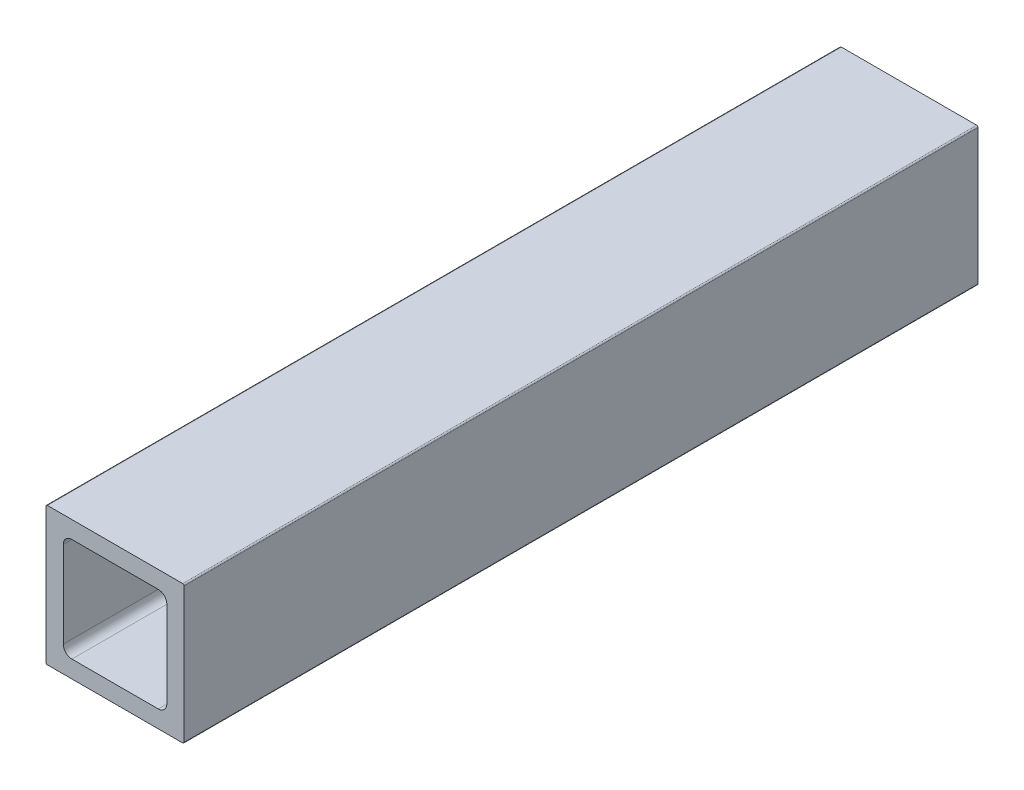
ISO-10303-21;
HEADER;
FILE_DESCRIPTION(('STEP AP214'),'2;1');
FILE_NAME('part.step','',(''),(''),'','','');
FILE_SCHEMA(('AUTOMOTIVE_DESIGN { 1 0 10303 214 1 1 1 1 }'));
ENDSEC;
DATA;
#1=APPLICATION_CONTEXT('core data for automotive mechanical design processes');
#2=APPLICATION_PROTOCOL_DEFINITION('international standard','automotive_design',2000,#1);
#3=PRODUCT_CONTEXT('',#1,'mechanical');
#4=PRODUCT('Part','Part','',(#3));
#5=PRODUCT_RELATED_PRODUCT_CATEGORY('part','',(#4));
#6=PRODUCT_DEFINITION_FORMATION('','',#4);
#7=PRODUCT_DEFINITION_CONTEXT('part definition',#1,'design');
#8=PRODUCT_DEFINITION('design','',#6,#7);
#9=PRODUCT_DEFINITION_SHAPE('','',#8);
#10=(LENGTH_UNIT() NAMED_UNIT(*) SI_UNIT(.MILLI.,.METRE.));
#11=(NAMED_UNIT(*) PLANE_ANGLE_UNIT() SI_UNIT($,.RADIAN.));
#12=(NAMED_UNIT(*) SI_UNIT($,.STERADIAN.) SOLID_ANGLE_UNIT());
#13=UNCERTAINTY_MEASURE_WITH_UNIT(LENGTH_MEASURE(1.E-05),#10,'distance_accuracy_value','');
#14=(GEOMETRIC_REPRESENTATION_CONTEXT(3) GLOBAL_UNCERTAINTY_ASSIGNED_CONTEXT((#13)) GLOBAL_UNIT_ASSIGNED_CONTEXT((#10,
#11,#12)) REPRESENTATION_CONTEXT('',''));
#15=CARTESIAN_POINT('',(0.,0.,0.));
#16=DIRECTION('',(0.,0.,1.));
#17=DIRECTION('',(1.,0.,0.));
#18=AXIS2_PLACEMENT_3D('',#15,#16,#17);
#19=CARTESIAN_POINT('',(0.254,0.254,0.));
#20=DIRECTION('',(0.,0.,-1.));
#21=DIRECTION('',(0.,-1.,0.));
#22=AXIS2_PLACEMENT_3D('',#19,#20,#21);
#23=PLANE('',#22);
#24=CARTESIAN_POINT('',(0.254,0.254,0.));
#25=DIRECTION('',(0.,0.,1.));
#26=DIRECTION('',(-1.,0.,0.));
#27=AXIS2_PLACEMENT_3D('',#24,#25,#26);
#28=CIRCLE('',#27,0.254);
#29=CARTESIAN_POINT('',(0.,0.254,0.));
#30=VERTEX_POINT('',#29);
#31=CARTESIAN_POINT('',(0.254,0.,0.));
#32=VERTEX_POINT('',#31);
#33=EDGE_CURVE('E193',#30,#32,#28,.T.);
#34=ORIENTED_EDGE('',*,*,#33,.F.);
#35=DIRECTION('',(0.,-1.,0.));
#36=VECTOR('',#35,1.);
#37=CARTESIAN_POINT('',(0.,0.254,0.));
#38=LINE('',#37,#36);
#39=CARTESIAN_POINT('',(0.,25.146,0.));
#40=VERTEX_POINT('',#39);
#41=EDGE_CURVE('E191',#40,#30,#38,.T.);
#42=ORIENTED_EDGE('',*,*,#41,.F.);
#43=CARTESIAN_POINT('',(0.254,25.146,0.));
#44=DIRECTION('',(0.,0.,1.));
#45=DIRECTION('',(-1.,0.,0.));
#46=AXIS2_PLACEMENT_3D('',#43,#44,#45);
#47=CIRCLE('',#46,0.254);
#48=CARTESIAN_POINT('',(0.254,25.4,0.));
#49=VERTEX_POINT('',#48);
#50=EDGE_CURVE('E213',#49,#40,#47,.T.);
#51=ORIENTED_EDGE('',*,*,#50,.F.);
#52=DIRECTION('',(-1.,0.,0.));
#53=VECTOR('',#52,1.);
#54=CARTESIAN_POINT('',(0.254,25.4,0.));
#55=LINE('',#54,#53);
#56=CARTESIAN_POINT('',(25.146,25.4,0.));
#57=VERTEX_POINT('',#56);
#58=EDGE_CURVE('E204',#57,#49,#55,.T.);
#59=ORIENTED_EDGE('',*,*,#58,.F.);
#60=CARTESIAN_POINT('',(25.146,25.146,0.));
#61=DIRECTION('',(0.,0.,1.));
#62=DIRECTION('',(-1.,0.,0.));
#63=AXIS2_PLACEMENT_3D('',#60,#61,#62);
#64=CIRCLE('',#63,0.254);
#65=CARTESIAN_POINT('',(25.4,25.146,0.));
#66=VERTEX_POINT('',#65);
#67=EDGE_CURVE('E236',#66,#57,#64,.T.);
#68=ORIENTED_EDGE('',*,*,#67,.F.);
#69=DIRECTION('',(0.,1.,0.));
#70=VECTOR('',#69,1.);
#71=CARTESIAN_POINT('',(25.4,0.254,0.));
#72=LINE('',#71,#70);
#73=CARTESIAN_POINT('',(25.4,0.254,0.));
#74=VERTEX_POINT('',#73);
#75=EDGE_CURVE('E235',#74,#66,#72,.T.);
#76=ORIENTED_EDGE('',*,*,#75,.F.);
#77=CARTESIAN_POINT('',(25.146,0.254,0.));
#78=DIRECTION('',(0.,0.,1.));
#79=DIRECTION('',(1.,0.,0.));
#80=AXIS2_PLACEMENT_3D('',#77,#78,#79);
#81=CIRCLE('',#80,0.254);
#82=CARTESIAN_POINT('',(25.146,0.,0.));
#83=VERTEX_POINT('',#82);
#84=EDGE_CURVE('E206',#83,#74,#81,.T.);
#85=ORIENTED_EDGE('',*,*,#84,.F.);
#86=DIRECTION('',(1.,0.,0.));
#87=VECTOR('',#86,1.);
#88=CARTESIAN_POINT('',(0.254,0.,0.));
#89=LINE('',#88,#87);
#90=EDGE_CURVE('E194',#32,#83,#89,.T.);
#91=ORIENTED_EDGE('',*,*,#90,.F.);
#92=EDGE_LOOP('',(#34,#42,#51,#59,#68,#76,#85,#91));
#93=FACE_BOUND('',#92,.T.);
#94=DIRECTION('',(0.,-1.,0.));
#95=VECTOR('',#94,1.);
#96=CARTESIAN_POINT('',(3.175,4.7625,0.));
#97=LINE('',#96,#95);
#98=CARTESIAN_POINT('',(3.175,20.6375,0.));
#99=VERTEX_POINT('',#98);
#100=CARTESIAN_POINT('',(3.175,4.7625,0.));
#101=VERTEX_POINT('',#100);
#102=EDGE_CURVE('E52',#99,#101,#97,.T.);
#103=ORIENTED_EDGE('',*,*,#102,.T.);
#104=CARTESIAN_POINT('',(4.7625,4.7625,0.));
#105=DIRECTION('',(0.,0.,1.));
#106=DIRECTION('',(1.,0.,0.));
#107=AXIS2_PLACEMENT_3D('',#104,#105,#106);
#108=CIRCLE('',#107,1.5875);
#109=CARTESIAN_POINT('',(4.7625,3.175,0.));
#110=VERTEX_POINT('',#109);
#111=EDGE_CURVE('E266',#101,#110,#108,.T.);
#112=ORIENTED_EDGE('',*,*,#111,.T.);
#113=DIRECTION('',(1.,0.,0.));
#114=VECTOR('',#113,1.);
#115=CARTESIAN_POINT('',(4.7625,3.175,0.));
#116=LINE('',#115,#114);
#117=CARTESIAN_POINT('',(20.6375,3.175,0.));
#118=VERTEX_POINT('',#117);
#119=EDGE_CURVE('E250',#110,#118,#116,.T.);
#120=ORIENTED_EDGE('',*,*,#119,.T.);
#121=CARTESIAN_POINT('',(20.6375,4.7625,0.));
#122=DIRECTION('',(0.,0.,1.));
#123=DIRECTION('',(-1.,0.,0.));
#124=AXIS2_PLACEMENT_3D('',#121,#122,#123);
#125=CIRCLE('',#124,1.5875);
#126=CARTESIAN_POINT('',(22.225,4.7625,0.));
#127=VERTEX_POINT('',#126);
#128=EDGE_CURVE('E223',#118,#127,#125,.T.);
#129=ORIENTED_EDGE('',*,*,#128,.T.);
#130=DIRECTION('',(0.,1.,0.));
#131=VECTOR('',#130,1.);
#132=CARTESIAN_POINT('',(22.225,4.7625,0.));
#133=LINE('',#132,#131);
#134=CARTESIAN_POINT('',(22.225,20.6375,0.));
#135=VERTEX_POINT('',#134);
#136=EDGE_CURVE('E219',#127,#135,#133,.T.);
#137=ORIENTED_EDGE('',*,*,#136,.T.);
#138=CARTESIAN_POINT('',(20.6375,20.6375,0.));
#139=DIRECTION('',(0.,0.,1.));
#140=DIRECTION('',(-1.,0.,0.));
#141=AXIS2_PLACEMENT_3D('',#138,#139,#140);
#142=CIRCLE('',#141,1.5875);
#143=CARTESIAN_POINT('',(20.6375,22.225,0.));
#144=VERTEX_POINT('',#143);
#145=EDGE_CURVE('E224',#135,#144,#142,.T.);
#146=ORIENTED_EDGE('',*,*,#145,.T.);
#147=DIRECTION('',(-1.,0.,0.));
#148=VECTOR('',#147,1.);
#149=CARTESIAN_POINT('',(4.7625,22.225,0.));
#150=LINE('',#149,#148);
#151=CARTESIAN_POINT('',(4.7625,22.225,0.));
#152=VERTEX_POINT('',#151);
#153=EDGE_CURVE('E229',#144,#152,#150,.T.);
#154=ORIENTED_EDGE('',*,*,#153,.T.);
#155=CARTESIAN_POINT('',(4.7625,20.6375,0.));
#156=DIRECTION('',(0.,0.,1.));
#157=DIRECTION('',(-1.,0.,0.));
#158=AXIS2_PLACEMENT_3D('',#155,#156,#157);
#159=CIRCLE('',#158,1.5875);
#160=EDGE_CURVE('E197',#152,#99,#159,.T.);
#161=ORIENTED_EDGE('',*,*,#160,.T.);
#162=EDGE_LOOP('',(#103,#112,#120,#129,#137,#146,#154,#161));
#163=FACE_BOUND('',#162,.T.);
#164=ADVANCED_FACE('F44',(#93,#163),#23,.T.);
#165=CARTESIAN_POINT('',(0.254,0.254,1828.8));
#166=DIRECTION('',(0.,0.,-1.));
#167=DIRECTION('',(-1.,0.,0.));
#168=AXIS2_PLACEMENT_3D('',#165,#166,#167);
#169=CYLINDRICAL_SURFACE('',#168,0.254);
#170=CARTESIAN_POINT('',(0.254,0.254,146.05));
#171=DIRECTION('',(0.,0.,-1.));
#172=DIRECTION('',(-1.,0.,0.));
#173=AXIS2_PLACEMENT_3D('',#170,#171,#172);
#174=CIRCLE('',#173,0.254);
#175=CARTESIAN_POINT('',(0.,0.254,146.05));
#176=VERTEX_POINT('',#175);
#177=CARTESIAN_POINT('',(0.254,0.,146.05));
#178=VERTEX_POINT('',#177);
#179=EDGE_CURVE('E172',#176,#178,#174,.F.);
#180=ORIENTED_EDGE('',*,*,#179,.F.);
#181=DIRECTION('',(0.,0.,-1.));
#182=VECTOR('',#181,1.);
#183=CARTESIAN_POINT('',(0.,0.254,1828.8));
#184=LINE('',#183,#182);
#185=EDGE_CURVE('E183',#176,#30,#184,.T.);
#186=ORIENTED_EDGE('',*,*,#185,.T.);
#187=ORIENTED_EDGE('',*,*,#33,.T.);
#188=DIRECTION('',(0.,0.,-1.));
#189=VECTOR('',#188,1.);
#190=CARTESIAN_POINT('',(0.254,0.,1828.8));
#191=LINE('',#190,#189);
#192=EDGE_CURVE('E185',#178,#32,#191,.T.);
#193=ORIENTED_EDGE('',*,*,#192,.F.);
#194=EDGE_LOOP('',(#180,#186,#187,#193));
#195=FACE_BOUND('',#194,.T.);
#196=ADVANCED_FACE('F181',(#195),#169,.T.);
#197=CARTESIAN_POINT('',(0.254,0.,1828.8));
#198=DIRECTION('',(0.,1.,0.));
#199=DIRECTION('',(1.,0.,0.));
#200=AXIS2_PLACEMENT_3D('',#197,#198,#199);
#201=PLANE('',#200);
#202=DIRECTION('',(0.,0.,-1.));
#203=VECTOR('',#202,1.);
#204=CARTESIAN_POINT('',(25.146,0.,1828.8));
#205=LINE('',#204,#203);
#206=CARTESIAN_POINT('',(25.146,0.,146.05));
#207=VERTEX_POINT('',#206);
#208=EDGE_CURVE('E210',#207,#83,#205,.T.);
#209=ORIENTED_EDGE('',*,*,#208,.F.);
#210=DIRECTION('',(1.,0.,0.));
#211=VECTOR('',#210,1.);
#212=CARTESIAN_POINT('',(0.,0.,146.05));
#213=LINE('',#212,#211);
#214=EDGE_CURVE('E177',#178,#207,#213,.T.);
#215=ORIENTED_EDGE('',*,*,#214,.F.);
#216=ORIENTED_EDGE('',*,*,#192,.T.);
#217=ORIENTED_EDGE('',*,*,#90,.T.);
#218=EDGE_LOOP('',(#209,#215,#216,#217));
#219=FACE_BOUND('',#218,.T.);
#220=ADVANCED_FACE('F289',(#219),#201,.F.);
#221=CARTESIAN_POINT('',(25.146,0.254,1828.8));
#222=DIRECTION('',(0.,0.,-1.));
#223=DIRECTION('',(-1.,0.,0.));
#224=AXIS2_PLACEMENT_3D('',#221,#222,#223);
#225=CYLINDRICAL_SURFACE('',#224,0.254);
#226=CARTESIAN_POINT('',(25.146,0.254,146.05));
#227=DIRECTION('',(0.,0.,-1.));
#228=DIRECTION('',(-1.,0.,0.));
#229=AXIS2_PLACEMENT_3D('',#226,#227,#228);
#230=CIRCLE('',#229,0.254);
#231=CARTESIAN_POINT('',(25.4,0.254,146.05));
#232=VERTEX_POINT('',#231);
#233=EDGE_CURVE('E187',#207,#232,#230,.F.);
#234=ORIENTED_EDGE('',*,*,#233,.F.);
#235=ORIENTED_EDGE('',*,*,#208,.T.);
#236=ORIENTED_EDGE('',*,*,#84,.T.);
#237=DIRECTION('',(0.,0.,-1.));
#238=VECTOR('',#237,1.);
#239=CARTESIAN_POINT('',(25.4,0.254,1828.8));
#240=LINE('',#239,#238);
#241=EDGE_CURVE('E233',#232,#74,#240,.T.);
#242=ORIENTED_EDGE('',*,*,#241,.F.);
#243=EDGE_LOOP('',(#234,#235,#236,#242));
#244=FACE_BOUND('',#243,.T.);
#245=ADVANCED_FACE('F283',(#244),#225,.T.);
#246=CARTESIAN_POINT('',(25.4,0.254,1828.8));
#247=DIRECTION('',(-1.,0.,0.));
#248=DIRECTION('',(0.,0.,1.));
#249=AXIS2_PLACEMENT_3D('',#246,#247,#248);
#250=PLANE('',#249);
#251=DIRECTION('',(0.,0.,-1.));
#252=VECTOR('',#251,1.);
#253=CARTESIAN_POINT('',(25.4,25.146,1828.8));
#254=LINE('',#253,#252);
#255=CARTESIAN_POINT('',(25.4,25.146,146.05));
#256=VERTEX_POINT('',#255);
#257=EDGE_CURVE('E258',#256,#66,#254,.T.);
#258=ORIENTED_EDGE('',*,*,#257,.F.);
#259=DIRECTION('',(0.,1.,0.));
#260=VECTOR('',#259,1.);
#261=CARTESIAN_POINT('',(25.4,0.,146.05));
#262=LINE('',#261,#260);
#263=EDGE_CURVE('E498',#232,#256,#262,.T.);
#264=ORIENTED_EDGE('',*,*,#263,.F.);
#265=ORIENTED_EDGE('',*,*,#241,.T.);
#266=ORIENTED_EDGE('',*,*,#75,.T.);
#267=EDGE_LOOP('',(#258,#264,#265,#266));
#268=FACE_BOUND('',#267,.T.);
#269=ADVANCED_FACE('F288',(#268),#250,.F.);
#270=CARTESIAN_POINT('',(25.146,25.146,1828.8));
#271=DIRECTION('',(0.,0.,-1.));
#272=DIRECTION('',(-1.,0.,0.));
#273=AXIS2_PLACEMENT_3D('',#270,#271,#272);
#274=CYLINDRICAL_SURFACE('',#273,0.254);
#275=CARTESIAN_POINT('',(25.146,25.146,146.05));
#276=DIRECTION('',(0.,0.,-1.));
#277=DIRECTION('',(-1.,0.,0.));
#278=AXIS2_PLACEMENT_3D('',#275,#276,#277);
#279=CIRCLE('',#278,0.254);
#280=CARTESIAN_POINT('',(25.146,25.4,146.05));
#281=VERTEX_POINT('',#280);
#282=EDGE_CURVE('E492',#256,#281,#279,.F.);
#283=ORIENTED_EDGE('',*,*,#282,.F.);
#284=ORIENTED_EDGE('',*,*,#257,.T.);
#285=ORIENTED_EDGE('',*,*,#67,.T.);
#286=DIRECTION('',(0.,0.,-1.));
#287=VECTOR('',#286,1.);
#288=CARTESIAN_POINT('',(25.146,25.4,1828.8));
#289=LINE('',#288,#287);
#290=EDGE_CURVE('E227',#281,#57,#289,.T.);
#291=ORIENTED_EDGE('',*,*,#290,.F.);
#292=EDGE_LOOP('',(#283,#284,#285,#291));
#293=FACE_BOUND('',#292,.T.);
#294=ADVANCED_FACE('F46',(#293),#274,.T.);
#295=CARTESIAN_POINT('',(0.254,25.4,1828.8));
#296=DIRECTION('',(0.,-1.,0.));
#297=DIRECTION('',(0.,0.,-1.));
#298=AXIS2_PLACEMENT_3D('',#295,#296,#297);
#299=PLANE('',#298);
#300=DIRECTION('',(0.,0.,-1.));
#301=VECTOR('',#300,1.);
#302=CARTESIAN_POINT('',(0.254,25.4,1828.8));
#303=LINE('',#302,#301);
#304=CARTESIAN_POINT('',(0.254,25.4,146.05));
#305=VERTEX_POINT('',#304);
#306=EDGE_CURVE('E211',#305,#49,#303,.T.);
#307=ORIENTED_EDGE('',*,*,#306,.F.);
#308=DIRECTION('',(-1.,0.,0.));
#309=VECTOR('',#308,1.);
#310=CARTESIAN_POINT('',(0.,25.4,146.05));
#311=LINE('',#310,#309);
#312=EDGE_CURVE('E545',#281,#305,#311,.T.);
#313=ORIENTED_EDGE('',*,*,#312,.F.);
#314=ORIENTED_EDGE('',*,*,#290,.T.);
#315=ORIENTED_EDGE('',*,*,#58,.T.);
#316=EDGE_LOOP('',(#307,#313,#314,#315));
#317=FACE_BOUND('',#316,.T.);
#318=ADVANCED_FACE('F347',(#317),#299,.F.);
#319=CARTESIAN_POINT('',(0.254,25.146,1828.8));
#320=DIRECTION('',(0.,0.,-1.));
#321=DIRECTION('',(-1.,0.,0.));
#322=AXIS2_PLACEMENT_3D('',#319,#320,#321);
#323=CYLINDRICAL_SURFACE('',#322,0.254);
#324=CARTESIAN_POINT('',(0.254,25.146,146.05));
#325=DIRECTION('',(0.,0.,-1.));
#326=DIRECTION('',(-1.,0.,0.));
#327=AXIS2_PLACEMENT_3D('',#324,#325,#326);
#328=CIRCLE('',#327,0.254);
#329=CARTESIAN_POINT('',(0.,25.146,146.05));
#330=VERTEX_POINT('',#329);
#331=EDGE_CURVE('E59',#305,#330,#328,.F.);
#332=ORIENTED_EDGE('',*,*,#331,.F.);
#333=ORIENTED_EDGE('',*,*,#306,.T.);
#334=ORIENTED_EDGE('',*,*,#50,.T.);
#335=DIRECTION('',(0.,0.,-1.));
#336=VECTOR('',#335,1.);
#337=CARTESIAN_POINT('',(0.,25.146,1828.8));
#338=LINE('',#337,#336);
#339=EDGE_CURVE('E216',#330,#40,#338,.T.);
#340=ORIENTED_EDGE('',*,*,#339,.F.);
#341=EDGE_LOOP('',(#332,#333,#334,#340));
#342=FACE_BOUND('',#341,.T.);
#343=ADVANCED_FACE('F276',(#342),#323,.T.);
#344=CARTESIAN_POINT('',(0.,0.254,1828.8));
#345=DIRECTION('',(1.,0.,0.));
#346=DIRECTION('',(0.,1.,0.));
#347=AXIS2_PLACEMENT_3D('',#344,#345,#346);
#348=PLANE('',#347);
#349=ORIENTED_EDGE('',*,*,#185,.F.);
#350=DIRECTION('',(0.,-1.,0.));
#351=VECTOR('',#350,1.);
#352=CARTESIAN_POINT('',(0.,0.,146.05));
#353=LINE('',#352,#351);
#354=EDGE_CURVE('E169',#330,#176,#353,.T.);
#355=ORIENTED_EDGE('',*,*,#354,.F.);
#356=ORIENTED_EDGE('',*,*,#339,.T.);
#357=ORIENTED_EDGE('',*,*,#41,.T.);
#358=EDGE_LOOP('',(#349,#355,#356,#357));
#359=FACE_BOUND('',#358,.T.);
#360=ADVANCED_FACE('F189',(#359),#348,.F.);
#361=CARTESIAN_POINT('',(4.7625,4.7625,1828.8));
#362=DIRECTION('',(0.,0.,-1.));
#363=DIRECTION('',(-1.,0.,0.));
#364=AXIS2_PLACEMENT_3D('',#361,#362,#363);
#365=CYLINDRICAL_SURFACE('',#364,1.5875);
#366=DIRECTION('',(0.,0.,-1.));
#367=VECTOR('',#366,1.);
#368=CARTESIAN_POINT('',(3.175,4.7625,1828.8));
#369=LINE('',#368,#367);
#370=CARTESIAN_POINT('',(3.175,4.7625,146.05));
#371=VERTEX_POINT('',#370);
#372=EDGE_CURVE('E186',#371,#101,#369,.T.);
#373=ORIENTED_EDGE('',*,*,#372,.F.);
#374=CARTESIAN_POINT('',(4.7625,4.7625,146.05));
#375=DIRECTION('',(0.,0.,-1.));
#376=DIRECTION('',(-1.,0.,0.));
#377=AXIS2_PLACEMENT_3D('',#374,#375,#376);
#378=CIRCLE('',#377,1.5875);
#379=CARTESIAN_POINT('',(4.7625,3.175,146.05));
#380=VERTEX_POINT('',#379);
#381=EDGE_CURVE('E66',#371,#380,#378,.F.);
#382=ORIENTED_EDGE('',*,*,#381,.T.);
#383=DIRECTION('',(0.,0.,-1.));
#384=VECTOR('',#383,1.);
#385=CARTESIAN_POINT('',(4.7625,3.175,1828.8));
#386=LINE('',#385,#384);
#387=EDGE_CURVE('E214',#380,#110,#386,.T.);
#388=ORIENTED_EDGE('',*,*,#387,.T.);
#389=ORIENTED_EDGE('',*,*,#111,.F.);
#390=EDGE_LOOP('',(#373,#382,#388,#389));
#391=FACE_BOUND('',#390,.T.);
#392=ADVANCED_FACE('F275',(#391),#365,.F.);
#393=CARTESIAN_POINT('',(4.7625,3.175,1828.8));
#394=DIRECTION('',(0.,1.,0.));
#395=DIRECTION('',(1.,0.,0.));
#396=AXIS2_PLACEMENT_3D('',#393,#394,#395);
#397=PLANE('',#396);
#398=DIRECTION('',(-1.,0.,0.));
#399=VECTOR('',#398,1.);
#400=CARTESIAN_POINT('',(4.7625,3.175,146.05));
#401=LINE('',#400,#399);
#402=CARTESIAN_POINT('',(20.6375,3.175,146.05));
#403=VERTEX_POINT('',#402);
#404=EDGE_CURVE('E532',#403,#380,#401,.T.);
#405=ORIENTED_EDGE('',*,*,#404,.F.);
#406=DIRECTION('',(0.,0.,-1.));
#407=VECTOR('',#406,1.);
#408=CARTESIAN_POINT('',(20.6375,3.175,1828.8));
#409=LINE('',#408,#407);
#410=EDGE_CURVE('E217',#403,#118,#409,.T.);
#411=ORIENTED_EDGE('',*,*,#410,.T.);
#412=ORIENTED_EDGE('',*,*,#119,.F.);
#413=ORIENTED_EDGE('',*,*,#387,.F.);
#414=EDGE_LOOP('',(#405,#411,#412,#413));
#415=FACE_BOUND('',#414,.T.);
#416=ADVANCED_FACE('F302',(#415),#397,.T.);
#417=CARTESIAN_POINT('',(20.6375,4.7625,1828.8));
#418=DIRECTION('',(0.,0.,-1.));
#419=DIRECTION('',(-1.,0.,0.));
#420=AXIS2_PLACEMENT_3D('',#417,#418,#419);
#421=CYLINDRICAL_SURFACE('',#420,1.5875);
#422=ORIENTED_EDGE('',*,*,#410,.F.);
#423=CARTESIAN_POINT('',(20.6375,4.7625,146.05));
#424=DIRECTION('',(0.,0.,-1.));
#425=DIRECTION('',(-1.,0.,0.));
#426=AXIS2_PLACEMENT_3D('',#423,#424,#425);
#427=CIRCLE('',#426,1.5875);
#428=CARTESIAN_POINT('',(22.225,4.7625,146.05));
#429=VERTEX_POINT('',#428);
#430=EDGE_CURVE('E513',#403,#429,#427,.F.);
#431=ORIENTED_EDGE('',*,*,#430,.T.);
#432=DIRECTION('',(0.,0.,-1.));
#433=VECTOR('',#432,1.);
#434=CARTESIAN_POINT('',(22.225,4.7625,1828.8));
#435=LINE('',#434,#433);
#436=EDGE_CURVE('E254',#429,#127,#435,.T.);
#437=ORIENTED_EDGE('',*,*,#436,.T.);
#438=ORIENTED_EDGE('',*,*,#128,.F.);
#439=EDGE_LOOP('',(#422,#431,#437,#438));
#440=FACE_BOUND('',#439,.T.);
#441=ADVANCED_FACE('F297',(#440),#421,.F.);
#442=CARTESIAN_POINT('',(22.225,4.7625,1828.8));
#443=DIRECTION('',(-1.,0.,0.));
#444=DIRECTION('',(0.,0.,1.));
#445=AXIS2_PLACEMENT_3D('',#442,#443,#444);
#446=PLANE('',#445);
#447=DIRECTION('',(0.,-1.,0.));
#448=VECTOR('',#447,1.);
#449=CARTESIAN_POINT('',(22.225,4.7625,146.05));
#450=LINE('',#449,#448);
#451=CARTESIAN_POINT('',(22.225,20.6375,146.05));
#452=VERTEX_POINT('',#451);
#453=EDGE_CURVE('E535',#452,#429,#450,.T.);
#454=ORIENTED_EDGE('',*,*,#453,.F.);
#455=DIRECTION('',(0.,0.,-1.));
#456=VECTOR('',#455,1.);
#457=CARTESIAN_POINT('',(22.225,20.6375,1828.8));
#458=LINE('',#457,#456);
#459=EDGE_CURVE('E240',#452,#135,#458,.T.);
#460=ORIENTED_EDGE('',*,*,#459,.T.);
#461=ORIENTED_EDGE('',*,*,#136,.F.);
#462=ORIENTED_EDGE('',*,*,#436,.F.);
#463=EDGE_LOOP('',(#454,#460,#461,#462));
#464=FACE_BOUND('',#463,.T.);
#465=ADVANCED_FACE('F301',(#464),#446,.T.);
#466=CARTESIAN_POINT('',(20.6375,20.6375,1828.8));
#467=DIRECTION('',(0.,0.,-1.));
#468=DIRECTION('',(-1.,0.,0.));
#469=AXIS2_PLACEMENT_3D('',#466,#467,#468);
#470=CYLINDRICAL_SURFACE('',#469,1.5875);
#471=ORIENTED_EDGE('',*,*,#459,.F.);
#472=CARTESIAN_POINT('',(20.6375,20.6375,146.05));
#473=DIRECTION('',(0.,0.,-1.));
#474=DIRECTION('',(-1.,0.,0.));
#475=AXIS2_PLACEMENT_3D('',#472,#473,#474);
#476=CIRCLE('',#475,1.5875);
#477=CARTESIAN_POINT('',(20.6375,22.225,146.05));
#478=VERTEX_POINT('',#477);
#479=EDGE_CURVE('E537',#452,#478,#476,.F.);
#480=ORIENTED_EDGE('',*,*,#479,.T.);
#481=DIRECTION('',(0.,0.,-1.));
#482=VECTOR('',#481,1.);
#483=CARTESIAN_POINT('',(20.6375,22.225,1828.8));
#484=LINE('',#483,#482);
#485=EDGE_CURVE('E238',#478,#144,#484,.T.);
#486=ORIENTED_EDGE('',*,*,#485,.T.);
#487=ORIENTED_EDGE('',*,*,#145,.F.);
#488=EDGE_LOOP('',(#471,#480,#486,#487));
#489=FACE_BOUND('',#488,.T.);
#490=ADVANCED_FACE('F309',(#489),#470,.F.);
#491=CARTESIAN_POINT('',(4.7625,22.225,1828.8));
#492=DIRECTION('',(0.,-1.,0.));
#493=DIRECTION('',(0.,0.,-1.));
#494=AXIS2_PLACEMENT_3D('',#491,#492,#493);
#495=PLANE('',#494);
#496=DIRECTION('',(1.,0.,0.));
#497=VECTOR('',#496,1.);
#498=CARTESIAN_POINT('',(4.7625,22.225,146.05));
#499=LINE('',#498,#497);
#500=CARTESIAN_POINT('',(4.7625,22.225,146.05));
#501=VERTEX_POINT('',#500);
#502=EDGE_CURVE('E540',#501,#478,#499,.T.);
#503=ORIENTED_EDGE('',*,*,#502,.F.);
#504=DIRECTION('',(0.,0.,-1.));
#505=VECTOR('',#504,1.);
#506=CARTESIAN_POINT('',(4.7625,22.225,1828.8));
#507=LINE('',#506,#505);
#508=EDGE_CURVE('E241',#501,#152,#507,.T.);
#509=ORIENTED_EDGE('',*,*,#508,.T.);
#510=ORIENTED_EDGE('',*,*,#153,.F.);
#511=ORIENTED_EDGE('',*,*,#485,.F.);
#512=EDGE_LOOP('',(#503,#509,#510,#511));
#513=FACE_BOUND('',#512,.T.);
#514=ADVANCED_FACE('F313',(#513),#495,.T.);
#515=CARTESIAN_POINT('',(4.7625,20.6375,1828.8));
#516=DIRECTION('',(0.,0.,-1.));
#517=DIRECTION('',(-1.,0.,0.));
#518=AXIS2_PLACEMENT_3D('',#515,#516,#517);
#519=CYLINDRICAL_SURFACE('',#518,1.5875);
#520=ORIENTED_EDGE('',*,*,#508,.F.);
#521=CARTESIAN_POINT('',(4.7625,20.6375,146.05));
#522=DIRECTION('',(0.,0.,-1.));
#523=DIRECTION('',(-1.,0.,0.));
#524=AXIS2_PLACEMENT_3D('',#521,#522,#523);
#525=CIRCLE('',#524,1.5875);
#526=CARTESIAN_POINT('',(3.175,20.6375,146.05));
#527=VERTEX_POINT('',#526);
#528=EDGE_CURVE('E542',#501,#527,#525,.F.);
#529=ORIENTED_EDGE('',*,*,#528,.T.);
#530=DIRECTION('',(0.,0.,-1.));
#531=VECTOR('',#530,1.);
#532=CARTESIAN_POINT('',(3.175,20.6375,1828.8));
#533=LINE('',#532,#531);
#534=EDGE_CURVE('E245',#527,#99,#533,.T.);
#535=ORIENTED_EDGE('',*,*,#534,.T.);
#536=ORIENTED_EDGE('',*,*,#160,.F.);
#537=EDGE_LOOP('',(#520,#529,#535,#536));
#538=FACE_BOUND('',#537,.T.);
#539=ADVANCED_FACE('F390',(#538),#519,.F.);
#540=CARTESIAN_POINT('',(3.175,4.7625,1828.8));
#541=DIRECTION('',(1.,0.,0.));
#542=DIRECTION('',(0.,1.,0.));
#543=AXIS2_PLACEMENT_3D('',#540,#541,#542);
#544=PLANE('',#543);
#545=DIRECTION('',(0.,1.,0.));
#546=VECTOR('',#545,1.);
#547=CARTESIAN_POINT('',(3.175,4.7625,146.05));
#548=LINE('',#547,#546);
#549=EDGE_CURVE('E11',#371,#527,#548,.T.);
#550=ORIENTED_EDGE('',*,*,#549,.F.);
#551=ORIENTED_EDGE('',*,*,#372,.T.);
#552=ORIENTED_EDGE('',*,*,#102,.F.);
#553=ORIENTED_EDGE('',*,*,#534,.F.);
#554=EDGE_LOOP('',(#550,#551,#552,#553));
#555=FACE_BOUND('',#554,.T.);
#556=ADVANCED_FACE('F394',(#555),#544,.T.);
#557=CARTESIAN_POINT('',(0.,0.,146.05));
#558=DIRECTION('',(0.,0.,-1.));
#559=DIRECTION('',(-1.,0.,0.));
#560=AXIS2_PLACEMENT_3D('',#557,#558,#559);
#561=PLANE('',#560);
#562=ORIENTED_EDGE('',*,*,#179,.T.);
#563=ORIENTED_EDGE('',*,*,#214,.T.);
#564=ORIENTED_EDGE('',*,*,#233,.T.);
#565=ORIENTED_EDGE('',*,*,#263,.T.);
#566=ORIENTED_EDGE('',*,*,#282,.T.);
#567=ORIENTED_EDGE('',*,*,#312,.T.);
#568=ORIENTED_EDGE('',*,*,#331,.T.);
#569=ORIENTED_EDGE('',*,*,#354,.T.);
#570=EDGE_LOOP('',(#562,#563,#564,#565,#566,#567,#568,#569));
#571=FACE_BOUND('',#570,.T.);
#572=ORIENTED_EDGE('',*,*,#549,.T.);
#573=ORIENTED_EDGE('',*,*,#528,.F.);
#574=ORIENTED_EDGE('',*,*,#502,.T.);
#575=ORIENTED_EDGE('',*,*,#479,.F.);
#576=ORIENTED_EDGE('',*,*,#453,.T.);
#577=ORIENTED_EDGE('',*,*,#430,.F.);
#578=ORIENTED_EDGE('',*,*,#404,.T.);
#579=ORIENTED_EDGE('',*,*,#381,.F.);
#580=EDGE_LOOP('',(#572,#573,#574,#575,#576,#577,#578,#579));
#581=FACE_BOUND('',#580,.T.);
#582=ADVANCED_FACE('F171',(#571,#581),#561,.F.);
#583=CLOSED_SHELL('',(#164,#196,#220,#245,#269,#294,#318,#343,#360,#392,#416,#441,#465,#490,
#514,#539,#556,#582));
#584=MANIFOLD_SOLID_BREP('B2',#583);
#585=ADVANCED_BREP_SHAPE_REPRESENTATION('',(#18,#584),#14);
#586=SHAPE_DEFINITION_REPRESENTATION(#9,#585);
ENDSEC;
END-ISO-10303-21;
